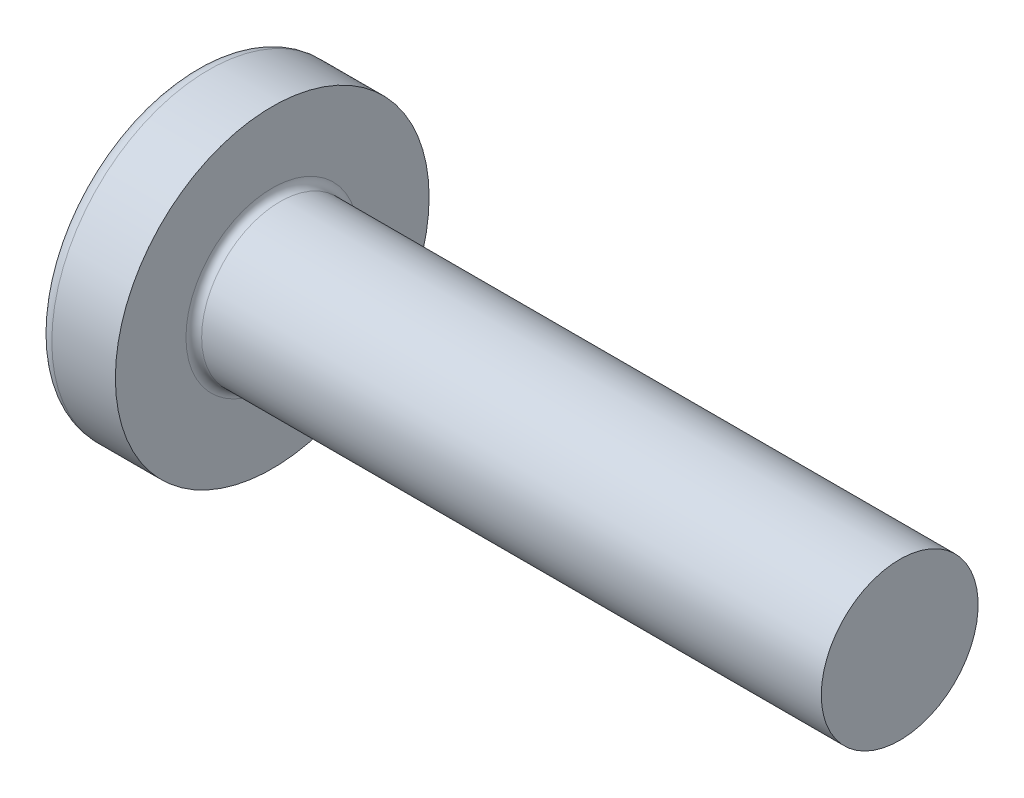
ISO-10303-21;
HEADER;
FILE_DESCRIPTION(('STEP AP214'),'2;1');
FILE_NAME('part.step','',(''),(''),'','','');
FILE_SCHEMA(('AUTOMOTIVE_DESIGN { 1 0 10303 214 1 1 1 1 }'));
ENDSEC;
DATA;
#1=APPLICATION_CONTEXT('core data for automotive mechanical design processes');
#2=APPLICATION_PROTOCOL_DEFINITION('international standard','automotive_design',2000,#1);
#3=PRODUCT_CONTEXT('',#1,'mechanical');
#4=PRODUCT('Part','Part','',(#3));
#5=PRODUCT_RELATED_PRODUCT_CATEGORY('part','',(#4));
#6=PRODUCT_DEFINITION_FORMATION('','',#4);
#7=PRODUCT_DEFINITION_CONTEXT('part definition',#1,'design');
#8=PRODUCT_DEFINITION('design','',#6,#7);
#9=PRODUCT_DEFINITION_SHAPE('','',#8);
#10=(LENGTH_UNIT() NAMED_UNIT(*) SI_UNIT(.MILLI.,.METRE.));
#11=(NAMED_UNIT(*) PLANE_ANGLE_UNIT() SI_UNIT($,.RADIAN.));
#12=(NAMED_UNIT(*) SI_UNIT($,.STERADIAN.) SOLID_ANGLE_UNIT());
#13=UNCERTAINTY_MEASURE_WITH_UNIT(LENGTH_MEASURE(1.E-05),#10,'distance_accuracy_value','');
#14=(GEOMETRIC_REPRESENTATION_CONTEXT(3) GLOBAL_UNCERTAINTY_ASSIGNED_CONTEXT((#13)) GLOBAL_UNIT_ASSIGNED_CONTEXT((#10,
#11,#12)) REPRESENTATION_CONTEXT('',''));
#15=CARTESIAN_POINT('',(0.,0.,0.));
#16=DIRECTION('',(0.,0.,1.));
#17=DIRECTION('',(1.,0.,0.));
#18=AXIS2_PLACEMENT_3D('',#15,#16,#17);
#19=CARTESIAN_POINT('',(3.2,0.,0.));
#20=DIRECTION('',(-1.,0.,0.));
#21=DIRECTION('',(0.,1.,0.));
#22=AXIS2_PLACEMENT_3D('',#19,#20,#21);
#23=SPHERICAL_SURFACE('',#22,3.2);
#24=CARTESIAN_POINT('',(0.646379599446113,0.,0.));
#25=DIRECTION('',(-1.,0.,0.));
#26=DIRECTION('',(0.,0.,1.));
#27=AXIS2_PLACEMENT_3D('',#24,#25,#26);
#28=CIRCLE('',#27,1.92847682119205);
#29=CARTESIAN_POINT('',(0.646379599446113,0.,1.92847682119205));
#30=VERTEX_POINT('',#29);
#31=EDGE_CURVE('E238',#30,#30,#28,.T.);
#32=ORIENTED_EDGE('',*,*,#31,.T.);
#33=EDGE_LOOP('',(#32));
#34=FACE_BOUND('',#33,.T.);
#35=CARTESIAN_POINT('',(0.0321614467928854,0.,0.));
#36=DIRECTION('',(1.,0.,0.));
#37=DIRECTION('',(0.,0.,-1.));
#38=AXIS2_PLACEMENT_3D('',#35,#36,#37);
#39=CIRCLE('',#38,0.452547125518057);
#40=CARTESIAN_POINT('',(0.0321614467928855,-0.239999999999999,-0.38366508938742));
#41=VERTEX_POINT('',#40);
#42=CARTESIAN_POINT('',(0.0321614467928854,-0.383665089387418,-0.24));
#43=VERTEX_POINT('',#42);
#44=EDGE_CURVE('E374',#41,#43,#39,.F.);
#45=ORIENTED_EDGE('',*,*,#44,.F.);
#46=CARTESIAN_POINT('',(3.2,-0.24,0.));
#47=DIRECTION('',(0.,1.,0.));
#48=DIRECTION('',(0.,0.,1.));
#49=AXIS2_PLACEMENT_3D('',#46,#47,#48);
#50=CIRCLE('',#49,3.19098730802866);
#51=CARTESIAN_POINT('',(0.160076673366103,-0.239999999999996,-0.970188728128243));
#52=VERTEX_POINT('',#51);
#53=EDGE_CURVE('E300',#52,#41,#50,.T.);
#54=ORIENTED_EDGE('',*,*,#53,.F.);
#55=CARTESIAN_POINT('',(2.98218780828175,0.,0.436863744320003));
#56=DIRECTION('',(0.446197753347436,0.,-0.894934391398443));
#57=DIRECTION('',(-0.894934391398443,0.,-0.446197753347436));
#58=AXIS2_PLACEMENT_3D('',#55,#56,#57);
#59=CIRCLE('',#58,3.16254769419176);
#60=CARTESIAN_POINT('',(0.160076673366103,0.240000000000003,-0.970188728128242));
#61=VERTEX_POINT('',#60);
#62=EDGE_CURVE('E272',#52,#61,#59,.T.);
#63=ORIENTED_EDGE('',*,*,#62,.T.);
#64=CARTESIAN_POINT('',(3.2,0.24,0.));
#65=DIRECTION('',(0.,-1.,0.));
#66=DIRECTION('',(0.,0.,-1.));
#67=AXIS2_PLACEMENT_3D('',#64,#65,#66);
#68=CIRCLE('',#67,3.19098730802866);
#69=CARTESIAN_POINT('',(0.0321614467928858,0.240000000000001,-0.383665089387418));
#70=VERTEX_POINT('',#69);
#71=EDGE_CURVE('E327',#70,#61,#68,.T.);
#72=ORIENTED_EDGE('',*,*,#71,.F.);
#73=CARTESIAN_POINT('',(0.0321614467928854,0.383665089387418,-0.24));
#74=VERTEX_POINT('',#73);
#75=EDGE_CURVE('E393',#74,#70,#39,.F.);
#76=ORIENTED_EDGE('',*,*,#75,.F.);
#77=CARTESIAN_POINT('',(3.2,0.,-0.24));
#78=DIRECTION('',(0.,0.,1.));
#79=DIRECTION('',(1.,0.,0.));
#80=AXIS2_PLACEMENT_3D('',#77,#78,#79);
#81=CIRCLE('',#80,3.19098730802866);
#82=CARTESIAN_POINT('',(0.160076673366103,0.970188728128243,-0.24));
#83=VERTEX_POINT('',#82);
#84=EDGE_CURVE('E266',#83,#74,#81,.T.);
#85=ORIENTED_EDGE('',*,*,#84,.F.);
#86=CARTESIAN_POINT('',(2.98218780828175,-0.436863744320002,0.));
#87=DIRECTION('',(0.446197753347436,0.894934391398443,0.));
#88=DIRECTION('',(-0.894934391398442,0.446197753347436,0.));
#89=AXIS2_PLACEMENT_3D('',#86,#87,#88);
#90=CIRCLE('',#89,3.16254769419176);
#91=CARTESIAN_POINT('',(0.160076673366103,0.970188728128243,0.24));
#92=VERTEX_POINT('',#91);
#93=EDGE_CURVE('E269',#83,#92,#90,.T.);
#94=ORIENTED_EDGE('',*,*,#93,.T.);
#95=CARTESIAN_POINT('',(3.2,0.,0.24));
#96=DIRECTION('',(0.,0.,-1.));
#97=DIRECTION('',(0.,1.,0.));
#98=AXIS2_PLACEMENT_3D('',#95,#96,#97);
#99=CIRCLE('',#98,3.19098730802866);
#100=CARTESIAN_POINT('',(0.0321614467928854,0.383665089387418,0.24));
#101=VERTEX_POINT('',#100);
#102=EDGE_CURVE('E262',#101,#92,#99,.T.);
#103=ORIENTED_EDGE('',*,*,#102,.F.);
#104=CARTESIAN_POINT('',(0.0321614467928861,0.239999999999999,0.38366508938742));
#105=VERTEX_POINT('',#104);
#106=EDGE_CURVE('E392',#105,#101,#39,.F.);
#107=ORIENTED_EDGE('',*,*,#106,.F.);
#108=CARTESIAN_POINT('',(0.160076673366103,0.239999999999997,0.970188728128244));
#109=VERTEX_POINT('',#108);
#110=EDGE_CURVE('E282',#109,#105,#68,.T.);
#111=ORIENTED_EDGE('',*,*,#110,.F.);
#112=CARTESIAN_POINT('',(2.98218780828175,0.,-0.436863744320002));
#113=DIRECTION('',(0.446197753347436,0.,0.894934391398443));
#114=DIRECTION('',(0.894934391398442,0.,-0.446197753347436));
#115=AXIS2_PLACEMENT_3D('',#112,#113,#114);
#116=CIRCLE('',#115,3.16254769419176);
#117=CARTESIAN_POINT('',(0.160076673366103,-0.240000000000003,0.970188728128242));
#118=VERTEX_POINT('',#117);
#119=EDGE_CURVE('E49',#109,#118,#116,.T.);
#120=ORIENTED_EDGE('',*,*,#119,.T.);
#121=CARTESIAN_POINT('',(0.0321614467928858,-0.240000000000001,0.383665089387418));
#122=VERTEX_POINT('',#121);
#123=EDGE_CURVE('E279',#122,#118,#50,.T.);
#124=ORIENTED_EDGE('',*,*,#123,.F.);
#125=CARTESIAN_POINT('',(0.0321614467928854,-0.383665089387418,0.24));
#126=VERTEX_POINT('',#125);
#127=EDGE_CURVE('E432',#126,#122,#39,.F.);
#128=ORIENTED_EDGE('',*,*,#127,.F.);
#129=CARTESIAN_POINT('',(0.160076673366103,-0.970188728128243,0.24));
#130=VERTEX_POINT('',#129);
#131=EDGE_CURVE('E263',#130,#126,#99,.T.);
#132=ORIENTED_EDGE('',*,*,#131,.F.);
#133=CARTESIAN_POINT('',(2.98218780828175,0.436863744320003,0.));
#134=DIRECTION('',(0.446197753347436,-0.894934391398443,0.));
#135=DIRECTION('',(0.894934391398443,0.446197753347436,0.));
#136=AXIS2_PLACEMENT_3D('',#133,#134,#135);
#137=CIRCLE('',#136,3.16254769419176);
#138=CARTESIAN_POINT('',(0.160076673366103,-0.970188728128243,-0.24));
#139=VERTEX_POINT('',#138);
#140=EDGE_CURVE('E259',#130,#139,#137,.T.);
#141=ORIENTED_EDGE('',*,*,#140,.T.);
#142=EDGE_CURVE('E64',#43,#139,#81,.T.);
#143=ORIENTED_EDGE('',*,*,#142,.F.);
#144=EDGE_LOOP('',(#45,#54,#63,#72,#76,#85,#94,#103,#107,#111,#120,#124,#128,#132,#141,#143));
#145=FACE_BOUND('',#144,.T.);
#146=ADVANCED_FACE('F35',(#34,#145),#23,.T.);
#147=CARTESIAN_POINT('',(1.42,0.342014234961647,-0.24));
#148=DIRECTION('',(0.,0.,1.));
#149=DIRECTION('',(1.,0.,0.));
#150=AXIS2_PLACEMENT_3D('',#147,#148,#149);
#151=PLANE('',#150);
#152=ORIENTED_EDGE('',*,*,#84,.T.);
#153=CARTESIAN_POINT('',(-0.626811087646333,0.437068483432734,-0.24));
#154=CARTESIAN_POINT('',(-0.489788496188268,0.426133650699674,-0.24));
#155=CARTESIAN_POINT('',(-0.35277275089666,0.415111501640762,-0.24));
#156=CARTESIAN_POINT('',(-0.078757882964478,0.392826208775377,-0.24));
#157=CARTESIAN_POINT('',(0.0582412392502161,0.381563059737591,-0.24));
#158=CARTESIAN_POINT('',(0.332213907654152,0.358729879929546,-0.24));
#159=CARTESIAN_POINT('',(0.469187453856035,0.347159849311357,-0.24));
#160=CARTESIAN_POINT('',(0.743097225439297,0.323608060039765,-0.24));
#161=CARTESIAN_POINT('',(0.880033451350377,0.311626307573655,-0.24));
#162=CARTESIAN_POINT('',(1.12503843743479,0.289667437089413,-0.24));
#163=CARTESIAN_POINT('',(1.23311691792,0.279799173776849,-0.24));
#164=CARTESIAN_POINT('',(1.4492267018282,0.259570129968442,-0.24));
#165=CARTESIAN_POINT('',(1.55725800577256,0.249209355061897,-0.24));
#166=CARTESIAN_POINT('',(1.77325939831777,0.227783788850472,-0.24));
#167=CARTESIAN_POINT('',(1.88122948205844,0.216718947894398,-0.24));
#168=CARTESIAN_POINT('',(2.04309848476113,0.199296215271932,-0.24));
#169=CARTESIAN_POINT('',(2.09704158415864,0.193350927204474,-0.24));
#170=CARTESIAN_POINT('',(2.20488609252136,0.181086542764125,-0.24));
#171=CARTESIAN_POINT('',(2.25878750075649,0.174767439988846,-0.24));
#172=CARTESIAN_POINT('',(2.31266102213859,0.168212174791089,-0.24));
#173=B_SPLINE_CURVE_WITH_KNOTS('',3,(#153,#154,#155,#156,#157,#158,#159,#160,#161,#162,#163,
#164,#165,#166,#167,#168,#169,#170,#171,#172),.UNSPECIFIED.,.F.,.F.,(4,2,2,2,2,2,2,2,2,4),(0.,
0.412374804430943,0.824758569256476,1.23714212973639,1.64951949568622,1.97510284899868,
2.30068250829037,2.62628515317116,2.78909323564388,2.95190410736571),.UNSPECIFIED.);
#174=CARTESIAN_POINT('',(1.42,0.262259890185289,-0.240000000000001));
#175=VERTEX_POINT('',#174);
#176=EDGE_CURVE('E416',#74,#175,#173,.T.);
#177=ORIENTED_EDGE('',*,*,#176,.T.);
#178=DIRECTION('',(0.,1.,0.));
#179=VECTOR('',#178,1.);
#180=CARTESIAN_POINT('',(1.42,-0.342014234961647,-0.24));
#181=LINE('',#180,#179);
#182=CARTESIAN_POINT('',(1.42,0.342014234961648,-0.24));
#183=VERTEX_POINT('',#182);
#184=EDGE_CURVE('E356',#175,#183,#181,.T.);
#185=ORIENTED_EDGE('',*,*,#184,.T.);
#186=DIRECTION('',(0.894934391398442,-0.446197753347436,0.));
#187=VECTOR('',#186,1.);
#188=CARTESIAN_POINT('',(0.,1.05,-0.24));
#189=LINE('',#188,#187);
#190=EDGE_CURVE('E239',#83,#183,#189,.T.);
#191=ORIENTED_EDGE('',*,*,#190,.F.);
#192=EDGE_LOOP('',(#152,#177,#185,#191));
#193=FACE_BOUND('',#192,.T.);
#194=ADVANCED_FACE('F194',(#193),#151,.T.);
#195=CARTESIAN_POINT('',(1.42,-0.342014234961647,-0.24));
#196=VERTEX_POINT('',#195);
#197=CARTESIAN_POINT('',(1.42,-0.262259890185289,-0.240000000000001));
#198=VERTEX_POINT('',#197);
#199=EDGE_CURVE('E247',#196,#198,#181,.T.);
#200=ORIENTED_EDGE('',*,*,#199,.T.);
#201=CARTESIAN_POINT('',(-0.626811087646333,-0.437068483432734,-0.24));
#202=CARTESIAN_POINT('',(-0.489788496188268,-0.426133650699674,-0.24));
#203=CARTESIAN_POINT('',(-0.35277275089666,-0.415111501640762,-0.24));
#204=CARTESIAN_POINT('',(-0.078757882964478,-0.392826208775377,-0.24));
#205=CARTESIAN_POINT('',(0.0582412392502161,-0.381563059737591,-0.24));
#206=CARTESIAN_POINT('',(0.332213907654152,-0.358729879929546,-0.24));
#207=CARTESIAN_POINT('',(0.469187453856035,-0.347159849311357,-0.24));
#208=CARTESIAN_POINT('',(0.743097225439297,-0.323608060039765,-0.24));
#209=CARTESIAN_POINT('',(0.880033451350377,-0.311626307573655,-0.24));
#210=CARTESIAN_POINT('',(1.12503843743479,-0.289667437089413,-0.24));
#211=CARTESIAN_POINT('',(1.23311691792,-0.279799173776849,-0.24));
#212=CARTESIAN_POINT('',(1.4492267018282,-0.259570129968442,-0.24));
#213=CARTESIAN_POINT('',(1.55725800577256,-0.249209355061897,-0.24));
#214=CARTESIAN_POINT('',(1.77325939831777,-0.227783788850472,-0.24));
#215=CARTESIAN_POINT('',(1.88122948205844,-0.216718947894399,-0.24));
#216=CARTESIAN_POINT('',(2.04309848476113,-0.199296215271932,-0.24));
#217=CARTESIAN_POINT('',(2.09704158415864,-0.193350927204474,-0.24));
#218=CARTESIAN_POINT('',(2.20488609252136,-0.181086542764125,-0.24));
#219=CARTESIAN_POINT('',(2.25878750075649,-0.174767439988846,-0.24));
#220=CARTESIAN_POINT('',(2.31266102213859,-0.168212174791089,-0.24));
#221=B_SPLINE_CURVE_WITH_KNOTS('',3,(#201,#202,#203,#204,#205,#206,#207,#208,#209,#210,#211,
#212,#213,#214,#215,#216,#217,#218,#219,#220),.UNSPECIFIED.,.F.,.F.,(4,2,2,2,2,2,2,2,2,4),(0.,
0.412374804430943,0.824758569256476,1.23714212973639,1.64951949568622,1.97510284899868,
2.30068250829037,2.62628515317116,2.78909323564388,2.95190410736571),.UNSPECIFIED.);
#222=EDGE_CURVE('E391',#198,#43,#221,.F.);
#223=ORIENTED_EDGE('',*,*,#222,.T.);
#224=ORIENTED_EDGE('',*,*,#142,.T.);
#225=DIRECTION('',(0.894934391398442,0.446197753347436,0.));
#226=VECTOR('',#225,1.);
#227=CARTESIAN_POINT('',(0.,-1.05,-0.24));
#228=LINE('',#227,#226);
#229=EDGE_CURVE('E330',#139,#196,#228,.T.);
#230=ORIENTED_EDGE('',*,*,#229,.T.);
#231=EDGE_LOOP('',(#200,#223,#224,#230));
#232=FACE_BOUND('',#231,.T.);
#233=ADVANCED_FACE('F200',(#232),#151,.T.);
#234=CARTESIAN_POINT('',(1.42,-0.342014234961647,0.24));
#235=DIRECTION('',(0.,0.,-1.));
#236=DIRECTION('',(0.,1.,0.));
#237=AXIS2_PLACEMENT_3D('',#234,#235,#236);
#238=PLANE('',#237);
#239=DIRECTION('',(0.,-1.,0.));
#240=VECTOR('',#239,1.);
#241=CARTESIAN_POINT('',(1.42,0.342014234961648,0.24));
#242=LINE('',#241,#240);
#243=CARTESIAN_POINT('',(1.42,0.342014234961648,0.24));
#244=VERTEX_POINT('',#243);
#245=CARTESIAN_POINT('',(1.42,0.262259890185289,0.240000000000001));
#246=VERTEX_POINT('',#245);
#247=EDGE_CURVE('E339',#244,#246,#242,.T.);
#248=ORIENTED_EDGE('',*,*,#247,.T.);
#249=CARTESIAN_POINT('',(-0.626811087646333,0.437068483432734,0.24));
#250=CARTESIAN_POINT('',(-0.489788496188268,0.426133650699674,0.24));
#251=CARTESIAN_POINT('',(-0.35277275089666,0.415111501640761,0.24));
#252=CARTESIAN_POINT('',(-0.078757882964478,0.392826208775377,0.24));
#253=CARTESIAN_POINT('',(0.0582412392502161,0.381563059737591,0.24));
#254=CARTESIAN_POINT('',(0.332213907654152,0.358729879929546,0.24));
#255=CARTESIAN_POINT('',(0.469187453856035,0.347159849311357,0.24));
#256=CARTESIAN_POINT('',(0.743097225439297,0.323608060039765,0.24));
#257=CARTESIAN_POINT('',(0.880033451350377,0.311626307573655,0.24));
#258=CARTESIAN_POINT('',(1.12503843743479,0.289667437089413,0.24));
#259=CARTESIAN_POINT('',(1.23311691792,0.279799173776849,0.24));
#260=CARTESIAN_POINT('',(1.4492267018282,0.259570129968442,0.24));
#261=CARTESIAN_POINT('',(1.55725800577256,0.249209355061897,0.24));
#262=CARTESIAN_POINT('',(1.77325939831777,0.227783788850472,0.24));
#263=CARTESIAN_POINT('',(1.88122948205844,0.216718947894399,0.24));
#264=CARTESIAN_POINT('',(2.04309848476113,0.199296215271932,0.24));
#265=CARTESIAN_POINT('',(2.09704158415864,0.193350927204474,0.24));
#266=CARTESIAN_POINT('',(2.20488609252136,0.181086542764125,0.24));
#267=CARTESIAN_POINT('',(2.25878750075649,0.174767439988846,0.24));
#268=CARTESIAN_POINT('',(2.31266102213859,0.168212174791089,0.24));
#269=B_SPLINE_CURVE_WITH_KNOTS('',3,(#249,#250,#251,#252,#253,#254,#255,#256,#257,#258,#259,
#260,#261,#262,#263,#264,#265,#266,#267,#268),.UNSPECIFIED.,.F.,.F.,(4,2,2,2,2,2,2,2,2,4),(0.,
0.412374804430943,0.824758569256476,1.23714212973639,1.64951949568622,1.97510284899868,
2.30068250829037,2.62628515317116,2.78909323564388,2.95190410736571),.UNSPECIFIED.);
#270=EDGE_CURVE('E671',#246,#101,#269,.F.);
#271=ORIENTED_EDGE('',*,*,#270,.T.);
#272=ORIENTED_EDGE('',*,*,#102,.T.);
#273=DIRECTION('',(0.894934391398442,-0.446197753347436,0.));
#274=VECTOR('',#273,1.);
#275=CARTESIAN_POINT('',(0.,1.05,0.24));
#276=LINE('',#275,#274);
#277=EDGE_CURVE('E244',#92,#244,#276,.T.);
#278=ORIENTED_EDGE('',*,*,#277,.T.);
#279=EDGE_LOOP('',(#248,#271,#272,#278));
#280=FACE_BOUND('',#279,.T.);
#281=ADVANCED_FACE('F412',(#280),#238,.T.);
#282=ORIENTED_EDGE('',*,*,#131,.T.);
#283=CARTESIAN_POINT('',(-0.62681108769363,-0.437068483436507,0.24));
#284=CARTESIAN_POINT('',(-0.489788496230297,-0.426133650703048,0.24));
#285=CARTESIAN_POINT('',(-0.352772750933422,-0.415111501643733,0.24));
#286=CARTESIAN_POINT('',(-0.0787578829907059,-0.392826208777529,0.24));
#287=CARTESIAN_POINT('',(0.0582412392292548,-0.381563059739326,0.24));
#288=CARTESIAN_POINT('',(0.332213907649303,-0.358729879929962,0.24));
#289=CARTESIAN_POINT('',(0.46918745386203,-0.347159849310859,0.24));
#290=CARTESIAN_POINT('',(0.743097225466975,-0.323608060037368,0.24));
#291=CARTESIAN_POINT('',(0.880033451388893,-0.311626307570274,0.24));
#292=CARTESIAN_POINT('',(1.12503843748414,-0.289667437084935,0.24));
#293=CARTESIAN_POINT('',(1.23311691796934,-0.279799173772307,0.24));
#294=CARTESIAN_POINT('',(1.44922670187753,-0.259570129963748,0.24));
#295=CARTESIAN_POINT('',(1.55725800582188,-0.249209355057115,0.24));
#296=CARTESIAN_POINT('',(1.77325939836707,-0.227783788845471,0.24));
#297=CARTESIAN_POINT('',(1.88122948210773,-0.216718947889267,0.24));
#298=CARTESIAN_POINT('',(2.0430984848104,-0.199296215266543,0.24));
#299=CARTESIAN_POINT('',(2.0970415842079,-0.193350927198989,0.24));
#300=CARTESIAN_POINT('',(2.20488609257059,-0.181086542758414,0.24));
#301=CARTESIAN_POINT('',(2.25878750080571,-0.174767439983005,0.24));
#302=CARTESIAN_POINT('',(2.31266102218779,-0.168212174785095,0.24));
#303=B_SPLINE_CURVE_WITH_KNOTS('',3,(#283,#284,#285,#286,#287,#288,#289,#290,#291,#292,#293,
#294,#295,#296,#297,#298,#299,#300,#301,#302),.UNSPECIFIED.,.F.,.F.,(4,2,2,2,2,2,2,2,2,4),(0.,
0.412374804446791,0.824758569288173,1.23714212980074,1.64951949578321,1.97510284909568,
2.30068250838736,2.62628515326816,2.78909323574089,2.95190410746272),.UNSPECIFIED.);
#304=CARTESIAN_POINT('',(1.42,-0.262259890185289,0.240000000000001));
#305=VERTEX_POINT('',#304);
#306=EDGE_CURVE('E433',#126,#305,#303,.T.);
#307=ORIENTED_EDGE('',*,*,#306,.T.);
#308=CARTESIAN_POINT('',(1.42,-0.342014234961647,0.24));
#309=VERTEX_POINT('',#308);
#310=EDGE_CURVE('E341',#305,#309,#242,.T.);
#311=ORIENTED_EDGE('',*,*,#310,.T.);
#312=DIRECTION('',(0.894934391398442,0.446197753347436,0.));
#313=VECTOR('',#312,1.);
#314=CARTESIAN_POINT('',(0.,-1.05,0.24));
#315=LINE('',#314,#313);
#316=EDGE_CURVE('E332',#130,#309,#315,.T.);
#317=ORIENTED_EDGE('',*,*,#316,.F.);
#318=EDGE_LOOP('',(#282,#307,#311,#317));
#319=FACE_BOUND('',#318,.T.);
#320=ADVANCED_FACE('F519',(#319),#238,.T.);
#321=CARTESIAN_POINT('',(1.42,0.342014234961648,0.24));
#322=DIRECTION('',(0.446197753347436,0.894934391398443,0.));
#323=DIRECTION('',(-0.894934391398442,0.446197753347436,0.));
#324=AXIS2_PLACEMENT_3D('',#321,#322,#323);
#325=PLANE('',#324);
#326=CARTESIAN_POINT('',(2.01772965253961,0.0439972734550525,0.));
#327=DIRECTION('',(0.446197753347436,0.894934391398443,0.));
#328=DIRECTION('',(-0.894934391398443,0.446197753347436,0.));
#329=AXIS2_PLACEMENT_3D('',#326,#327,#328);
#330=ELLIPSE('',#329,0.703057486597294,0.310602005333466);
#331=CARTESIAN_POINT('',(1.42,0.342014234961649,0.0969871799961112));
#332=VERTEX_POINT('',#331);
#333=CARTESIAN_POINT('',(1.42,0.342014234961649,-0.0969871799961112));
#334=VERTEX_POINT('',#333);
#335=EDGE_CURVE('E305',#332,#334,#330,.F.);
#336=ORIENTED_EDGE('',*,*,#335,.F.);
#337=DIRECTION('',(0.,0.,-1.));
#338=VECTOR('',#337,1.);
#339=CARTESIAN_POINT('',(1.42,0.342014234961648,0.24));
#340=LINE('',#339,#338);
#341=EDGE_CURVE('E342',#244,#332,#340,.T.);
#342=ORIENTED_EDGE('',*,*,#341,.F.);
#343=ORIENTED_EDGE('',*,*,#277,.F.);
#344=ORIENTED_EDGE('',*,*,#93,.F.);
#345=ORIENTED_EDGE('',*,*,#190,.T.);
#346=EDGE_CURVE('E344',#334,#183,#340,.T.);
#347=ORIENTED_EDGE('',*,*,#346,.F.);
#348=EDGE_LOOP('',(#336,#342,#343,#344,#345,#347));
#349=FACE_BOUND('',#348,.T.);
#350=ADVANCED_FACE('F410',(#349),#325,.F.);
#351=CARTESIAN_POINT('',(0.,-1.05,-0.24));
#352=DIRECTION('',(0.446197753347436,-0.894934391398443,0.));
#353=DIRECTION('',(0.894934391398443,0.446197753347436,0.));
#354=AXIS2_PLACEMENT_3D('',#351,#352,#353);
#355=PLANE('',#354);
#356=CARTESIAN_POINT('',(2.01772965253961,-0.0439972734550525,0.));
#357=DIRECTION('',(0.446197753347436,-0.894934391398443,0.));
#358=DIRECTION('',(-0.894934391398443,-0.446197753347436,0.));
#359=AXIS2_PLACEMENT_3D('',#356,#357,#358);
#360=ELLIPSE('',#359,0.703057486597294,0.310602005333466);
#361=CARTESIAN_POINT('',(1.42,-0.342014234961648,-0.0969871799961126));
#362=VERTEX_POINT('',#361);
#363=CARTESIAN_POINT('',(1.42,-0.342014234961648,0.0969871799961125));
#364=VERTEX_POINT('',#363);
#365=EDGE_CURVE('E673',#362,#364,#360,.F.);
#366=ORIENTED_EDGE('',*,*,#365,.F.);
#367=DIRECTION('',(0.,0.,1.));
#368=VECTOR('',#367,1.);
#369=CARTESIAN_POINT('',(1.42,-0.342014234961647,-0.24));
#370=LINE('',#369,#368);
#371=EDGE_CURVE('E335',#196,#362,#370,.T.);
#372=ORIENTED_EDGE('',*,*,#371,.F.);
#373=ORIENTED_EDGE('',*,*,#229,.F.);
#374=ORIENTED_EDGE('',*,*,#140,.F.);
#375=ORIENTED_EDGE('',*,*,#316,.T.);
#376=EDGE_CURVE('E338',#364,#309,#370,.T.);
#377=ORIENTED_EDGE('',*,*,#376,.F.);
#378=EDGE_LOOP('',(#366,#372,#373,#374,#375,#377));
#379=FACE_BOUND('',#378,.T.);
#380=ADVANCED_FACE('F506',(#379),#355,.F.);
#381=CARTESIAN_POINT('',(1.42,0.342014234961648,-0.24));
#382=DIRECTION('',(-1.,0.,0.));
#383=DIRECTION('',(0.,0.,1.));
#384=AXIS2_PLACEMENT_3D('',#381,#382,#383);
#385=PLANE('',#384);
#386=DIRECTION('',(0.,1.,0.));
#387=VECTOR('',#386,1.);
#388=CARTESIAN_POINT('',(1.42,-0.240000000000001,0.342014234961647));
#389=LINE('',#388,#387);
#390=CARTESIAN_POINT('',(1.42,-0.240000000000001,0.342014234961647));
#391=VERTEX_POINT('',#390);
#392=CARTESIAN_POINT('',(1.42,-0.0969871799961162,0.342014234961647));
#393=VERTEX_POINT('',#392);
#394=EDGE_CURVE('E320',#391,#393,#389,.T.);
#395=ORIENTED_EDGE('',*,*,#394,.T.);
#396=CARTESIAN_POINT('',(1.42,0.,0.));
#397=DIRECTION('',(-1.,0.,0.));
#398=DIRECTION('',(0.,0.,1.));
#399=AXIS2_PLACEMENT_3D('',#396,#397,#398);
#400=CIRCLE('',#399,0.3555);
#401=CARTESIAN_POINT('',(1.42,-0.240000000000001,0.262259890185289));
#402=VERTEX_POINT('',#401);
#403=EDGE_CURVE('E701',#402,#393,#400,.T.);
#404=ORIENTED_EDGE('',*,*,#403,.F.);
#405=DIRECTION('',(0.,0.,-1.));
#406=VECTOR('',#405,1.);
#407=CARTESIAN_POINT('',(1.42,-0.240000000000001,0.342014234961647));
#408=LINE('',#407,#406);
#409=EDGE_CURVE('E316',#391,#402,#408,.T.);
#410=ORIENTED_EDGE('',*,*,#409,.F.);
#411=EDGE_LOOP('',(#395,#404,#410));
#412=FACE_BOUND('',#411,.T.);
#413=ADVANCED_FACE('F499',(#412),#385,.T.);
#414=ORIENTED_EDGE('',*,*,#310,.F.);
#415=EDGE_CURVE('E706',#364,#305,#400,.T.);
#416=ORIENTED_EDGE('',*,*,#415,.F.);
#417=ORIENTED_EDGE('',*,*,#376,.T.);
#418=EDGE_LOOP('',(#414,#416,#417));
#419=FACE_BOUND('',#418,.T.);
#420=ADVANCED_FACE('F492',(#419),#385,.T.);
#421=ORIENTED_EDGE('',*,*,#371,.T.);
#422=EDGE_CURVE('E385',#198,#362,#400,.T.);
#423=ORIENTED_EDGE('',*,*,#422,.F.);
#424=ORIENTED_EDGE('',*,*,#199,.F.);
#425=EDGE_LOOP('',(#421,#423,#424));
#426=FACE_BOUND('',#425,.T.);
#427=ADVANCED_FACE('F486',(#426),#385,.T.);
#428=CARTESIAN_POINT('',(1.42,-0.239999999999999,-0.262259890185288));
#429=VERTEX_POINT('',#428);
#430=CARTESIAN_POINT('',(1.42,-0.239999999999999,-0.342014234961648));
#431=VERTEX_POINT('',#430);
#432=EDGE_CURVE('E319',#429,#431,#408,.T.);
#433=ORIENTED_EDGE('',*,*,#432,.F.);
#434=CARTESIAN_POINT('',(1.42,-0.0969871799961157,-0.342014234961648));
#435=VERTEX_POINT('',#434);
#436=EDGE_CURVE('E56',#435,#429,#400,.T.);
#437=ORIENTED_EDGE('',*,*,#436,.F.);
#438=DIRECTION('',(0.,-1.,0.));
#439=VECTOR('',#438,1.);
#440=CARTESIAN_POINT('',(1.42,0.240000000000001,-0.342014234961646));
#441=LINE('',#440,#439);
#442=EDGE_CURVE('E315',#435,#431,#441,.T.);
#443=ORIENTED_EDGE('',*,*,#442,.T.);
#444=EDGE_LOOP('',(#433,#437,#443));
#445=FACE_BOUND('',#444,.T.);
#446=ADVANCED_FACE('F380',(#445),#385,.T.);
#447=CARTESIAN_POINT('',(1.42,0.240000000000001,-0.342014234961646));
#448=VERTEX_POINT('',#447);
#449=CARTESIAN_POINT('',(1.42,0.0969871799961181,-0.342014234961647));
#450=VERTEX_POINT('',#449);
#451=EDGE_CURVE('E312',#448,#450,#441,.T.);
#452=ORIENTED_EDGE('',*,*,#451,.T.);
#453=CARTESIAN_POINT('',(1.42,0.240000000000001,-0.262259890185288));
#454=VERTEX_POINT('',#453);
#455=EDGE_CURVE('E384',#454,#450,#400,.T.);
#456=ORIENTED_EDGE('',*,*,#455,.F.);
#457=DIRECTION('',(0.,0.,1.));
#458=VECTOR('',#457,1.);
#459=CARTESIAN_POINT('',(1.42,0.240000000000001,-0.342014234961646));
#460=LINE('',#459,#458);
#461=EDGE_CURVE('E324',#448,#454,#460,.T.);
#462=ORIENTED_EDGE('',*,*,#461,.F.);
#463=EDGE_LOOP('',(#452,#456,#462));
#464=FACE_BOUND('',#463,.T.);
#465=ADVANCED_FACE('F474',(#464),#385,.T.);
#466=ORIENTED_EDGE('',*,*,#184,.F.);
#467=EDGE_CURVE('E690',#334,#175,#400,.T.);
#468=ORIENTED_EDGE('',*,*,#467,.F.);
#469=ORIENTED_EDGE('',*,*,#346,.T.);
#470=EDGE_LOOP('',(#466,#468,#469));
#471=FACE_BOUND('',#470,.T.);
#472=ADVANCED_FACE('F467',(#471),#385,.T.);
#473=ORIENTED_EDGE('',*,*,#341,.T.);
#474=EDGE_CURVE('E692',#246,#332,#400,.T.);
#475=ORIENTED_EDGE('',*,*,#474,.F.);
#476=ORIENTED_EDGE('',*,*,#247,.F.);
#477=EDGE_LOOP('',(#473,#475,#476));
#478=FACE_BOUND('',#477,.T.);
#479=ADVANCED_FACE('F461',(#478),#385,.T.);
#480=CARTESIAN_POINT('',(1.42,0.239999999999999,0.342014234961648));
#481=DIRECTION('',(0.,-1.,0.));
#482=DIRECTION('',(1.,0.,0.));
#483=AXIS2_PLACEMENT_3D('',#480,#481,#482);
#484=PLANE('',#483);
#485=ORIENTED_EDGE('',*,*,#110,.T.);
#486=CARTESIAN_POINT('',(-0.62681108769363,0.239999999999998,0.437068483436508));
#487=CARTESIAN_POINT('',(-0.489788496230297,0.239999999999998,0.426133650703049));
#488=CARTESIAN_POINT('',(-0.352772750933422,0.239999999999998,0.415111501643734));
#489=CARTESIAN_POINT('',(-0.0787578829907058,0.239999999999999,0.39282620877753));
#490=CARTESIAN_POINT('',(0.058241239229255,0.239999999999999,0.381563059739327));
#491=CARTESIAN_POINT('',(0.332213907649304,0.239999999999999,0.358729879929963));
#492=CARTESIAN_POINT('',(0.46918745386203,0.239999999999999,0.34715984931086));
#493=CARTESIAN_POINT('',(0.743097225466975,0.239999999999999,0.323608060037369));
#494=CARTESIAN_POINT('',(0.880033451388893,0.239999999999999,0.311626307570275));
#495=CARTESIAN_POINT('',(1.12503843748414,0.239999999999999,0.289667437084936));
#496=CARTESIAN_POINT('',(1.23311691796933,0.239999999999999,0.279799173772307));
#497=CARTESIAN_POINT('',(1.44922670187753,0.239999999999999,0.259570129963749));
#498=CARTESIAN_POINT('',(1.55725800582188,0.239999999999999,0.249209355057116));
#499=CARTESIAN_POINT('',(1.77325939836707,0.239999999999999,0.227783788845472));
#500=CARTESIAN_POINT('',(1.88122948210773,0.239999999999999,0.216718947889268));
#501=CARTESIAN_POINT('',(2.0430984848104,0.239999999999999,0.199296215266544));
#502=CARTESIAN_POINT('',(2.0970415842079,0.239999999999999,0.19335092719899));
#503=CARTESIAN_POINT('',(2.20488609257059,0.239999999999999,0.181086542758414));
#504=CARTESIAN_POINT('',(2.25878750080571,0.239999999999999,0.174767439983006));
#505=CARTESIAN_POINT('',(2.31266102218779,0.239999999999999,0.168212174785095));
#506=B_SPLINE_CURVE_WITH_KNOTS('',3,(#486,#487,#488,#489,#490,#491,#492,#493,#494,#495,#496,
#497,#498,#499,#500,#501,#502,#503,#504,#505),.UNSPECIFIED.,.F.,.F.,(4,2,2,2,2,2,2,2,2,4),(0.,
0.412374804446791,0.824758569288173,1.23714212980074,1.64951949578321,1.97510284909568,
2.30068250838736,2.62628515326816,2.78909323574088,2.95190410746272),.UNSPECIFIED.);
#507=CARTESIAN_POINT('',(1.42,0.239999999999999,0.26225989018529));
#508=VERTEX_POINT('',#507);
#509=EDGE_CURVE('E670',#105,#508,#506,.T.);
#510=ORIENTED_EDGE('',*,*,#509,.T.);
#511=CARTESIAN_POINT('',(1.42,0.239999999999999,0.342014234961648));
#512=VERTEX_POINT('',#511);
#513=EDGE_CURVE('E297',#508,#512,#460,.T.);
#514=ORIENTED_EDGE('',*,*,#513,.T.);
#515=DIRECTION('',(0.894934391398442,0.,-0.446197753347436));
#516=VECTOR('',#515,1.);
#517=CARTESIAN_POINT('',(0.,0.239999999999996,1.05));
#518=LINE('',#517,#516);
#519=EDGE_CURVE('E290',#109,#512,#518,.T.);
#520=ORIENTED_EDGE('',*,*,#519,.F.);
#521=EDGE_LOOP('',(#485,#510,#514,#520));
#522=FACE_BOUND('',#521,.T.);
#523=ADVANCED_FACE('F294',(#522),#484,.T.);
#524=CARTESIAN_POINT('',(1.42,-0.239999999999999,-0.342014234961648));
#525=DIRECTION('',(0.,1.,0.));
#526=DIRECTION('',(0.,0.,1.));
#527=AXIS2_PLACEMENT_3D('',#524,#525,#526);
#528=PLANE('',#527);
#529=ORIENTED_EDGE('',*,*,#409,.T.);
#530=CARTESIAN_POINT('',(-0.626811087646333,-0.240000000000002,0.437068483432733));
#531=CARTESIAN_POINT('',(-0.489788496188268,-0.240000000000001,0.426133650699673));
#532=CARTESIAN_POINT('',(-0.35277275089666,-0.240000000000001,0.415111501640761));
#533=CARTESIAN_POINT('',(-0.078757882964478,-0.240000000000001,0.392826208775376));
#534=CARTESIAN_POINT('',(0.058241239250216,-0.240000000000001,0.38156305973759));
#535=CARTESIAN_POINT('',(0.332213907654152,-0.240000000000001,0.358729879929545));
#536=CARTESIAN_POINT('',(0.469187453856034,-0.240000000000001,0.347159849311357));
#537=CARTESIAN_POINT('',(0.743097225439297,-0.240000000000001,0.323608060039764));
#538=CARTESIAN_POINT('',(0.880033451350377,-0.240000000000001,0.311626307573654));
#539=CARTESIAN_POINT('',(1.12503843743479,-0.240000000000001,0.289667437089413));
#540=CARTESIAN_POINT('',(1.23311691791999,-0.240000000000001,0.279799173776848));
#541=CARTESIAN_POINT('',(1.4492267018282,-0.240000000000001,0.259570129968441));
#542=CARTESIAN_POINT('',(1.55725800577256,-0.240000000000001,0.249209355061896));
#543=CARTESIAN_POINT('',(1.77325939831777,-0.240000000000001,0.227783788850472));
#544=CARTESIAN_POINT('',(1.88122948205844,-0.240000000000001,0.216718947894398));
#545=CARTESIAN_POINT('',(2.04309848476113,-0.240000000000001,0.199296215271931));
#546=CARTESIAN_POINT('',(2.09704158415864,-0.240000000000001,0.193350927204474));
#547=CARTESIAN_POINT('',(2.20488609252136,-0.240000000000001,0.181086542764124));
#548=CARTESIAN_POINT('',(2.25878750075649,-0.240000000000001,0.174767439988845));
#549=CARTESIAN_POINT('',(2.31266102213859,-0.240000000000001,0.168212174791088));
#550=B_SPLINE_CURVE_WITH_KNOTS('',3,(#530,#531,#532,#533,#534,#535,#536,#537,#538,#539,#540,
#541,#542,#543,#544,#545,#546,#547,#548,#549),.UNSPECIFIED.,.F.,.F.,(4,2,2,2,2,2,2,2,2,4),(0.,
0.412374804430943,0.824758569256476,1.23714212973639,1.64951949568622,1.97510284899868,
2.30068250829037,2.62628515317116,2.78909323564388,2.95190410736571),.UNSPECIFIED.);
#551=EDGE_CURVE('E425',#402,#122,#550,.F.);
#552=ORIENTED_EDGE('',*,*,#551,.T.);
#553=ORIENTED_EDGE('',*,*,#123,.T.);
#554=DIRECTION('',(0.894934391398442,0.,-0.446197753347436));
#555=VECTOR('',#554,1.);
#556=CARTESIAN_POINT('',(0.,-0.240000000000004,1.05));
#557=LINE('',#556,#555);
#558=EDGE_CURVE('E292',#118,#391,#557,.T.);
#559=ORIENTED_EDGE('',*,*,#558,.T.);
#560=EDGE_LOOP('',(#529,#552,#553,#559));
#561=FACE_BOUND('',#560,.T.);
#562=ADVANCED_FACE('F229',(#561),#528,.T.);
#563=CARTESIAN_POINT('',(1.42,-0.240000000000001,0.342014234961647));
#564=DIRECTION('',(0.446197753347436,0.,0.894934391398443));
#565=DIRECTION('',(-0.894934391398442,0.,0.446197753347436));
#566=AXIS2_PLACEMENT_3D('',#563,#564,#565);
#567=PLANE('',#566);
#568=CARTESIAN_POINT('',(2.01772965253961,0.,0.0439972734550525));
#569=DIRECTION('',(0.446197753347436,0.,0.894934391398443));
#570=DIRECTION('',(-0.894934391398443,0.,0.446197753347436));
#571=AXIS2_PLACEMENT_3D('',#568,#569,#570);
#572=ELLIPSE('',#571,0.703057486597294,0.310602005333466);
#573=CARTESIAN_POINT('',(1.42,0.0969871799961138,0.342014234961648));
#574=VERTEX_POINT('',#573);
#575=EDGE_CURVE('E423',#393,#574,#572,.F.);
#576=ORIENTED_EDGE('',*,*,#575,.F.);
#577=ORIENTED_EDGE('',*,*,#394,.F.);
#578=ORIENTED_EDGE('',*,*,#558,.F.);
#579=ORIENTED_EDGE('',*,*,#119,.F.);
#580=ORIENTED_EDGE('',*,*,#519,.T.);
#581=EDGE_CURVE('E323',#574,#512,#389,.T.);
#582=ORIENTED_EDGE('',*,*,#581,.F.);
#583=EDGE_LOOP('',(#576,#577,#578,#579,#580,#582));
#584=FACE_BOUND('',#583,.T.);
#585=ADVANCED_FACE('F288',(#584),#567,.F.);
#586=CARTESIAN_POINT('',(0.,0.240000000000004,-1.05));
#587=DIRECTION('',(0.446197753347436,0.,-0.894934391398443));
#588=DIRECTION('',(0.894934391398443,0.,0.446197753347436));
#589=AXIS2_PLACEMENT_3D('',#586,#587,#588);
#590=PLANE('',#589);
#591=CARTESIAN_POINT('',(2.01772965253961,0.,-0.0439972734550526));
#592=DIRECTION('',(0.446197753347436,0.,-0.894934391398443));
#593=DIRECTION('',(-0.894934391398443,0.,-0.446197753347436));
#594=AXIS2_PLACEMENT_3D('',#591,#592,#593);
#595=ELLIPSE('',#594,0.703057486597294,0.310602005333466);
#596=EDGE_CURVE('E378',#450,#435,#595,.F.);
#597=ORIENTED_EDGE('',*,*,#596,.F.);
#598=ORIENTED_EDGE('',*,*,#451,.F.);
#599=DIRECTION('',(0.894934391398442,0.,0.446197753347436));
#600=VECTOR('',#599,1.);
#601=CARTESIAN_POINT('',(0.,0.240000000000004,-1.05));
#602=LINE('',#601,#600);
#603=EDGE_CURVE('E302',#61,#448,#602,.T.);
#604=ORIENTED_EDGE('',*,*,#603,.F.);
#605=ORIENTED_EDGE('',*,*,#62,.F.);
#606=DIRECTION('',(0.894934391398442,0.,0.446197753347436));
#607=VECTOR('',#606,1.);
#608=CARTESIAN_POINT('',(0.,-0.239999999999996,-1.05));
#609=LINE('',#608,#607);
#610=EDGE_CURVE('E309',#52,#431,#609,.T.);
#611=ORIENTED_EDGE('',*,*,#610,.T.);
#612=ORIENTED_EDGE('',*,*,#442,.F.);
#613=EDGE_LOOP('',(#597,#598,#604,#605,#611,#612));
#614=FACE_BOUND('',#613,.T.);
#615=ADVANCED_FACE('F369',(#614),#590,.F.);
#616=ORIENTED_EDGE('',*,*,#461,.T.);
#617=CARTESIAN_POINT('',(-0.626811087646333,0.240000000000001,-0.437068483432733));
#618=CARTESIAN_POINT('',(-0.489788496188268,0.240000000000001,-0.426133650699673));
#619=CARTESIAN_POINT('',(-0.35277275089666,0.240000000000001,-0.415111501640761));
#620=CARTESIAN_POINT('',(-0.0787578829644782,0.240000000000001,-0.392826208775376));
#621=CARTESIAN_POINT('',(0.0582412392502159,0.240000000000001,-0.38156305973759));
#622=CARTESIAN_POINT('',(0.332213907654152,0.240000000000001,-0.358729879929545));
#623=CARTESIAN_POINT('',(0.469187453856035,0.240000000000001,-0.347159849311357));
#624=CARTESIAN_POINT('',(0.743097225439297,0.240000000000001,-0.323608060039764));
#625=CARTESIAN_POINT('',(0.880033451350377,0.240000000000001,-0.311626307573654));
#626=CARTESIAN_POINT('',(1.12503843743479,0.240000000000001,-0.289667437089413));
#627=CARTESIAN_POINT('',(1.23311691792,0.240000000000001,-0.279799173776848));
#628=CARTESIAN_POINT('',(1.4492267018282,0.240000000000001,-0.259570129968441));
#629=CARTESIAN_POINT('',(1.55725800577256,0.240000000000001,-0.249209355061896));
#630=CARTESIAN_POINT('',(1.77325939831777,0.240000000000001,-0.227783788850471));
#631=CARTESIAN_POINT('',(1.88122948205844,0.240000000000001,-0.216718947894398));
#632=CARTESIAN_POINT('',(2.04309848476113,0.240000000000001,-0.199296215271931));
#633=CARTESIAN_POINT('',(2.09704158415864,0.240000000000001,-0.193350927204474));
#634=CARTESIAN_POINT('',(2.20488609252136,0.240000000000001,-0.181086542764124));
#635=CARTESIAN_POINT('',(2.25878750075649,0.240000000000001,-0.174767439988845));
#636=CARTESIAN_POINT('',(2.31266102213859,0.240000000000001,-0.168212174791088));
#637=B_SPLINE_CURVE_WITH_KNOTS('',3,(#617,#618,#619,#620,#621,#622,#623,#624,#625,#626,#627,
#628,#629,#630,#631,#632,#633,#634,#635,#636),.UNSPECIFIED.,.F.,.F.,(4,2,2,2,2,2,2,2,2,4),(0.,
0.412374804430943,0.824758569256476,1.23714212973639,1.64951949568622,1.97510284899868,
2.30068250829037,2.62628515317116,2.78909323564388,2.95190410736571),.UNSPECIFIED.);
#638=EDGE_CURVE('E365',#454,#70,#637,.F.);
#639=ORIENTED_EDGE('',*,*,#638,.T.);
#640=ORIENTED_EDGE('',*,*,#71,.T.);
#641=ORIENTED_EDGE('',*,*,#603,.T.);
#642=EDGE_LOOP('',(#616,#639,#640,#641));
#643=FACE_BOUND('',#642,.T.);
#644=ADVANCED_FACE('F227',(#643),#484,.T.);
#645=ORIENTED_EDGE('',*,*,#53,.T.);
#646=CARTESIAN_POINT('',(-0.626811087646333,-0.239999999999998,-0.437068483432735));
#647=CARTESIAN_POINT('',(-0.489788496188268,-0.239999999999998,-0.426133650699675));
#648=CARTESIAN_POINT('',(-0.35277275089666,-0.239999999999998,-0.415111501640762));
#649=CARTESIAN_POINT('',(-0.078757882964478,-0.239999999999998,-0.392826208775378));
#650=CARTESIAN_POINT('',(0.0582412392502161,-0.239999999999999,-0.381563059737592));
#651=CARTESIAN_POINT('',(0.332213907654152,-0.239999999999999,-0.358729879929547));
#652=CARTESIAN_POINT('',(0.469187453856035,-0.239999999999999,-0.347159849311358));
#653=CARTESIAN_POINT('',(0.743097225439297,-0.239999999999999,-0.323608060039766));
#654=CARTESIAN_POINT('',(0.880033451350377,-0.239999999999999,-0.311626307573656));
#655=CARTESIAN_POINT('',(1.12503843743479,-0.239999999999999,-0.289667437089414));
#656=CARTESIAN_POINT('',(1.23311691792,-0.239999999999999,-0.279799173776849));
#657=CARTESIAN_POINT('',(1.4492267018282,-0.239999999999999,-0.259570129968443));
#658=CARTESIAN_POINT('',(1.55725800577256,-0.239999999999999,-0.249209355061898));
#659=CARTESIAN_POINT('',(1.77325939831777,-0.239999999999999,-0.227783788850473));
#660=CARTESIAN_POINT('',(1.88122948205844,-0.239999999999999,-0.216718947894399));
#661=CARTESIAN_POINT('',(2.04309848476113,-0.239999999999999,-0.199296215271933));
#662=CARTESIAN_POINT('',(2.09704158415864,-0.239999999999999,-0.193350927204475));
#663=CARTESIAN_POINT('',(2.20488609252136,-0.239999999999999,-0.181086542764126));
#664=CARTESIAN_POINT('',(2.25878750075649,-0.239999999999999,-0.174767439988847));
#665=CARTESIAN_POINT('',(2.31266102213859,-0.239999999999999,-0.16821217479109));
#666=B_SPLINE_CURVE_WITH_KNOTS('',3,(#646,#647,#648,#649,#650,#651,#652,#653,#654,#655,#656,
#657,#658,#659,#660,#661,#662,#663,#664,#665),.UNSPECIFIED.,.F.,.F.,(4,2,2,2,2,2,2,2,2,4),(0.,
0.412374804430943,0.824758569256476,1.23714212973639,1.64951949568622,1.97510284899868,
2.30068250829037,2.62628515317116,2.78909323564388,2.95190410736571),.UNSPECIFIED.);
#667=EDGE_CURVE('E11',#41,#429,#666,.T.);
#668=ORIENTED_EDGE('',*,*,#667,.T.);
#669=ORIENTED_EDGE('',*,*,#432,.T.);
#670=ORIENTED_EDGE('',*,*,#610,.F.);
#671=EDGE_LOOP('',(#645,#668,#669,#670));
#672=FACE_BOUND('',#671,.T.);
#673=ADVANCED_FACE('F222',(#672),#528,.T.);
#674=CARTESIAN_POINT('',(-25.4,0.,0.));
#675=DIRECTION('',(-1.,0.,0.));
#676=DIRECTION('',(0.,0.,1.));
#677=AXIS2_PLACEMENT_3D('',#674,#675,#676);
#678=CYLINDRICAL_SURFACE('',#677,1.);
#679=CARTESIAN_POINT('',(1.7,0.,0.));
#680=DIRECTION('',(-1.,0.,0.));
#681=DIRECTION('',(0.,0.,1.));
#682=AXIS2_PLACEMENT_3D('',#679,#680,#681);
#683=CIRCLE('',#682,1.);
#684=CARTESIAN_POINT('',(1.7,0.,1.));
#685=VERTEX_POINT('',#684);
#686=EDGE_CURVE('E233',#685,#685,#683,.F.);
#687=ORIENTED_EDGE('',*,*,#686,.T.);
#688=EDGE_LOOP('',(#687));
#689=FACE_BOUND('',#688,.T.);
#690=CARTESIAN_POINT('',(9.6,0.,0.));
#691=DIRECTION('',(-1.,0.,0.));
#692=DIRECTION('',(0.,0.,1.));
#693=AXIS2_PLACEMENT_3D('',#690,#691,#692);
#694=CIRCLE('',#693,1.);
#695=CARTESIAN_POINT('',(9.6,0.,1.));
#696=VERTEX_POINT('',#695);
#697=EDGE_CURVE('E236',#696,#696,#694,.T.);
#698=ORIENTED_EDGE('',*,*,#697,.T.);
#699=EDGE_LOOP('',(#698));
#700=FACE_BOUND('',#699,.T.);
#701=ADVANCED_FACE('F219',(#689,#700),#678,.T.);
#702=CARTESIAN_POINT('',(1.6,1.,0.));
#703=DIRECTION('',(-1.,0.,0.));
#704=DIRECTION('',(0.,0.,1.));
#705=AXIS2_PLACEMENT_3D('',#702,#703,#704);
#706=PLANE('',#705);
#707=CARTESIAN_POINT('',(1.6,0.,0.));
#708=DIRECTION('',(-1.,0.,0.));
#709=DIRECTION('',(0.,0.,1.));
#710=AXIS2_PLACEMENT_3D('',#707,#708,#709);
#711=CIRCLE('',#710,1.1);
#712=CARTESIAN_POINT('',(1.6,0.,1.1));
#713=VERTEX_POINT('',#712);
#714=EDGE_CURVE('E255',#713,#713,#711,.T.);
#715=ORIENTED_EDGE('',*,*,#714,.T.);
#716=EDGE_LOOP('',(#715));
#717=FACE_BOUND('',#716,.T.);
#718=CARTESIAN_POINT('',(1.6,0.,0.));
#719=DIRECTION('',(-1.,0.,0.));
#720=DIRECTION('',(0.,0.,1.));
#721=AXIS2_PLACEMENT_3D('',#718,#719,#720);
#722=CIRCLE('',#721,2.);
#723=CARTESIAN_POINT('',(1.6,0.,2.));
#724=VERTEX_POINT('',#723);
#725=EDGE_CURVE('E252',#724,#724,#722,.T.);
#726=ORIENTED_EDGE('',*,*,#725,.F.);
#727=EDGE_LOOP('',(#726));
#728=FACE_BOUND('',#727,.T.);
#729=ADVANCED_FACE('F216',(#717,#728),#706,.F.);
#730=CARTESIAN_POINT('',(-25.4,0.,0.));
#731=DIRECTION('',(-1.,0.,0.));
#732=DIRECTION('',(0.,0.,1.));
#733=AXIS2_PLACEMENT_3D('',#730,#731,#732);
#734=CYLINDRICAL_SURFACE('',#733,2.);
#735=ORIENTED_EDGE('',*,*,#725,.T.);
#736=EDGE_LOOP('',(#735));
#737=FACE_BOUND('',#736,.T.);
#738=CARTESIAN_POINT('',(0.790020746977267,0.,0.));
#739=DIRECTION('',(-1.,0.,0.));
#740=DIRECTION('',(0.,0.,1.));
#741=AXIS2_PLACEMENT_3D('',#738,#739,#740);
#742=CIRCLE('',#741,2.);
#743=CARTESIAN_POINT('',(0.790020746977267,0.,2.));
#744=VERTEX_POINT('',#743);
#745=EDGE_CURVE('E241',#744,#744,#742,.T.);
#746=ORIENTED_EDGE('',*,*,#745,.F.);
#747=EDGE_LOOP('',(#746));
#748=FACE_BOUND('',#747,.T.);
#749=ADVANCED_FACE('F212',(#737,#748),#734,.T.);
#750=CARTESIAN_POINT('',(0.790020746977269,0.,0.));
#751=DIRECTION('',(-1.,0.,0.));
#752=DIRECTION('',(0.,0.,1.));
#753=AXIS2_PLACEMENT_3D('',#750,#751,#752);
#754=TOROIDAL_SURFACE('',#753,1.82,0.18);
#755=ORIENTED_EDGE('',*,*,#745,.T.);
#756=EDGE_LOOP('',(#755));
#757=FACE_BOUND('',#756,.T.);
#758=ORIENTED_EDGE('',*,*,#31,.F.);
#759=EDGE_LOOP('',(#758));
#760=FACE_BOUND('',#759,.T.);
#761=ADVANCED_FACE('F209',(#757,#760),#754,.T.);
#762=CARTESIAN_POINT('',(9.6,1.,0.));
#763=DIRECTION('',(1.,0.,0.));
#764=DIRECTION('',(0.,0.,-1.));
#765=AXIS2_PLACEMENT_3D('',#762,#763,#764);
#766=PLANE('',#765);
#767=ORIENTED_EDGE('',*,*,#697,.F.);
#768=EDGE_LOOP('',(#767));
#769=FACE_BOUND('',#768,.T.);
#770=ADVANCED_FACE('F207',(#769),#766,.T.);
#771=CARTESIAN_POINT('',(1.7,0.,0.));
#772=DIRECTION('',(-1.,0.,0.));
#773=DIRECTION('',(0.,0.,1.));
#774=AXIS2_PLACEMENT_3D('',#771,#772,#773);
#775=TOROIDAL_SURFACE('',#774,1.1,0.1);
#776=ORIENTED_EDGE('',*,*,#686,.F.);
#777=EDGE_LOOP('',(#776));
#778=FACE_BOUND('',#777,.T.);
#779=ORIENTED_EDGE('',*,*,#714,.F.);
#780=EDGE_LOOP('',(#779));
#781=FACE_BOUND('',#780,.T.);
#782=ADVANCED_FACE('F37',(#778,#781),#775,.F.);
#783=ORIENTED_EDGE('',*,*,#513,.F.);
#784=EDGE_CURVE('E386',#574,#508,#400,.T.);
#785=ORIENTED_EDGE('',*,*,#784,.F.);
#786=ORIENTED_EDGE('',*,*,#581,.T.);
#787=EDGE_LOOP('',(#783,#785,#786));
#788=FACE_BOUND('',#787,.T.);
#789=ADVANCED_FACE('F468',(#788),#385,.T.);
#790=CARTESIAN_POINT('',(1.42,0.,0.));
#791=DIRECTION('',(-1.,0.,0.));
#792=DIRECTION('',(0.,0.,1.));
#793=AXIS2_PLACEMENT_3D('',#790,#791,#792);
#794=CONICAL_SURFACE('',#793,0.3555,0.069813170079766);
#795=ORIENTED_EDGE('',*,*,#335,.T.);
#796=EDGE_CURVE('E687',#332,#334,#400,.T.);
#797=ORIENTED_EDGE('',*,*,#796,.F.);
#798=EDGE_LOOP('',(#795,#797));
#799=FACE_BOUND('',#798,.T.);
#800=ADVANCED_FACE('F191',(#799),#794,.F.);
#801=ORIENTED_EDGE('',*,*,#365,.T.);
#802=EDGE_CURVE('E707',#362,#364,#400,.T.);
#803=ORIENTED_EDGE('',*,*,#802,.F.);
#804=EDGE_LOOP('',(#801,#803));
#805=FACE_BOUND('',#804,.T.);
#806=ADVANCED_FACE('F601',(#805),#794,.F.);
#807=EDGE_CURVE('E388',#508,#246,#400,.T.);
#808=ORIENTED_EDGE('',*,*,#807,.F.);
#809=ORIENTED_EDGE('',*,*,#509,.F.);
#810=ORIENTED_EDGE('',*,*,#106,.T.);
#811=ORIENTED_EDGE('',*,*,#270,.F.);
#812=EDGE_LOOP('',(#808,#809,#810,#811));
#813=FACE_BOUND('',#812,.T.);
#814=ADVANCED_FACE('F607',(#813),#794,.F.);
#815=ORIENTED_EDGE('',*,*,#575,.T.);
#816=EDGE_CURVE('E389',#393,#574,#400,.T.);
#817=ORIENTED_EDGE('',*,*,#816,.F.);
#818=EDGE_LOOP('',(#815,#817));
#819=FACE_BOUND('',#818,.T.);
#820=ADVANCED_FACE('F614',(#819),#794,.F.);
#821=ORIENTED_EDGE('',*,*,#596,.T.);
#822=EDGE_CURVE('E381',#450,#435,#400,.T.);
#823=ORIENTED_EDGE('',*,*,#822,.F.);
#824=EDGE_LOOP('',(#821,#823));
#825=FACE_BOUND('',#824,.T.);
#826=ADVANCED_FACE('F621',(#825),#794,.F.);
#827=ORIENTED_EDGE('',*,*,#127,.T.);
#828=ORIENTED_EDGE('',*,*,#551,.F.);
#829=EDGE_CURVE('E703',#305,#402,#400,.T.);
#830=ORIENTED_EDGE('',*,*,#829,.F.);
#831=ORIENTED_EDGE('',*,*,#306,.F.);
#832=EDGE_LOOP('',(#827,#828,#830,#831));
#833=FACE_BOUND('',#832,.T.);
#834=ADVANCED_FACE('F628',(#833),#794,.F.);
#835=ORIENTED_EDGE('',*,*,#75,.T.);
#836=ORIENTED_EDGE('',*,*,#638,.F.);
#837=EDGE_CURVE('E693',#175,#454,#400,.T.);
#838=ORIENTED_EDGE('',*,*,#837,.F.);
#839=ORIENTED_EDGE('',*,*,#176,.F.);
#840=EDGE_LOOP('',(#835,#836,#838,#839));
#841=FACE_BOUND('',#840,.T.);
#842=ADVANCED_FACE('F189',(#841),#794,.F.);
#843=EDGE_CURVE('E382',#429,#198,#400,.T.);
#844=ORIENTED_EDGE('',*,*,#843,.F.);
#845=ORIENTED_EDGE('',*,*,#667,.F.);
#846=ORIENTED_EDGE('',*,*,#44,.T.);
#847=ORIENTED_EDGE('',*,*,#222,.F.);
#848=EDGE_LOOP('',(#844,#845,#846,#847));
#849=FACE_BOUND('',#848,.T.);
#850=ADVANCED_FACE('F184',(#849),#794,.F.);
#851=CARTESIAN_POINT('',(1.53550895201079,0.,0.));
#852=DIRECTION('',(-1.,0.,0.));
#853=DIRECTION('',(0.,0.,1.));
#854=AXIS2_PLACEMENT_3D('',#851,#852,#853);
#855=CONICAL_SURFACE('',#854,0.,1.25663706143593);
#856=ORIENTED_EDGE('',*,*,#784,.T.);
#857=ORIENTED_EDGE('',*,*,#807,.T.);
#858=ORIENTED_EDGE('',*,*,#474,.T.);
#859=ORIENTED_EDGE('',*,*,#796,.T.);
#860=ORIENTED_EDGE('',*,*,#467,.T.);
#861=ORIENTED_EDGE('',*,*,#837,.T.);
#862=ORIENTED_EDGE('',*,*,#455,.T.);
#863=ORIENTED_EDGE('',*,*,#822,.T.);
#864=ORIENTED_EDGE('',*,*,#436,.T.);
#865=ORIENTED_EDGE('',*,*,#843,.T.);
#866=ORIENTED_EDGE('',*,*,#422,.T.);
#867=ORIENTED_EDGE('',*,*,#802,.T.);
#868=ORIENTED_EDGE('',*,*,#415,.T.);
#869=ORIENTED_EDGE('',*,*,#829,.T.);
#870=ORIENTED_EDGE('',*,*,#403,.T.);
#871=ORIENTED_EDGE('',*,*,#816,.T.);
#872=EDGE_LOOP('',(#856,#857,#858,#859,#860,#861,#862,#863,#864,#865,#866,#867,#868,#869,#870,#871));
#873=FACE_BOUND('',#872,.T.);
#874=CARTESIAN_POINT('',(1.53550895201079,0.,0.));
#875=VERTEX_POINT('',#874);
#876=VERTEX_LOOP('',#875);
#877=FACE_BOUND('',#876,.T.);
#878=ADVANCED_FACE('F182',(#873,#877),#855,.F.);
#879=CLOSED_SHELL('',(#146,#194,#233,#281,#320,#350,#380,#413,#420,#427,#446,#465,#472,#479,
#523,#562,#585,#615,#644,#673,#701,#729,#749,#761,#770,#782,#789,#800,#806,#814,#820,#826,#834,
#842,#850,#878));
#880=MANIFOLD_SOLID_BREP('B2',#879);
#881=ADVANCED_BREP_SHAPE_REPRESENTATION('',(#18,#880),#14);
#882=SHAPE_DEFINITION_REPRESENTATION(#9,#881);
ENDSEC;
END-ISO-10303-21;
